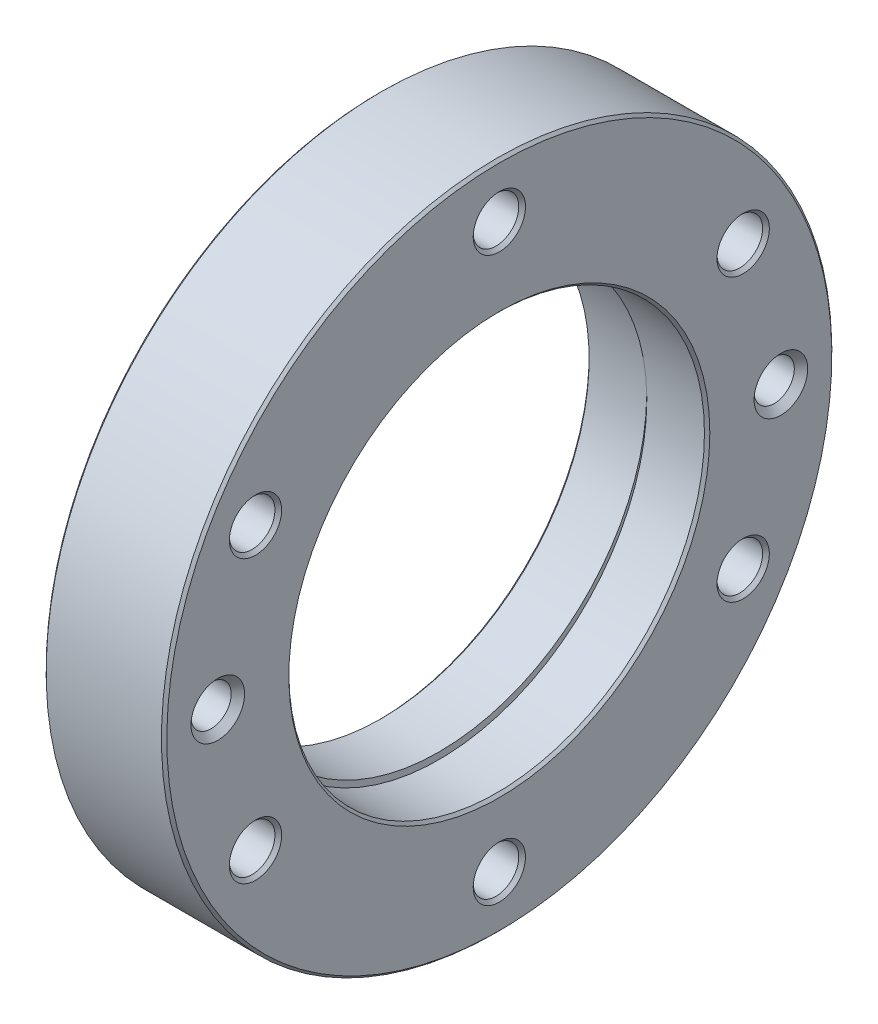
ISO-10303-21;
HEADER;
FILE_DESCRIPTION(('STEP AP214'),'2;1');
FILE_NAME('part.step','',(''),(''),'','','');
FILE_SCHEMA(('AUTOMOTIVE_DESIGN { 1 0 10303 214 1 1 1 1 }'));
ENDSEC;
DATA;
#1=APPLICATION_CONTEXT('core data for automotive mechanical design processes');
#2=APPLICATION_PROTOCOL_DEFINITION('international standard','automotive_design',2000,#1);
#3=PRODUCT_CONTEXT('',#1,'mechanical');
#4=PRODUCT('Part','Part','',(#3));
#5=PRODUCT_RELATED_PRODUCT_CATEGORY('part','',(#4));
#6=PRODUCT_DEFINITION_FORMATION('','',#4);
#7=PRODUCT_DEFINITION_CONTEXT('part definition',#1,'design');
#8=PRODUCT_DEFINITION('design','',#6,#7);
#9=PRODUCT_DEFINITION_SHAPE('','',#8);
#10=(LENGTH_UNIT() NAMED_UNIT(*) SI_UNIT(.MILLI.,.METRE.));
#11=(NAMED_UNIT(*) PLANE_ANGLE_UNIT() SI_UNIT($,.RADIAN.));
#12=(NAMED_UNIT(*) SI_UNIT($,.STERADIAN.) SOLID_ANGLE_UNIT());
#13=UNCERTAINTY_MEASURE_WITH_UNIT(LENGTH_MEASURE(1.E-05),#10,'distance_accuracy_value','');
#14=(GEOMETRIC_REPRESENTATION_CONTEXT(3) GLOBAL_UNCERTAINTY_ASSIGNED_CONTEXT((#13)) GLOBAL_UNIT_ASSIGNED_CONTEXT((#10,
#11,#12)) REPRESENTATION_CONTEXT('',''));
#15=CARTESIAN_POINT('',(0.,0.,0.));
#16=DIRECTION('',(0.,0.,1.));
#17=DIRECTION('',(1.,0.,0.));
#18=AXIS2_PLACEMENT_3D('',#15,#16,#17);
#19=CARTESIAN_POINT('',(57.8004303095138,-25.,0.));
#20=DIRECTION('',(-1.,0.,0.));
#21=DIRECTION('',(0.,-1.,0.));
#22=AXIS2_PLACEMENT_3D('',#19,#20,#21);
#23=PLANE('',#22);
#24=CARTESIAN_POINT('',(57.8004303095138,1.22515179113199E-11,0.));
#25=DIRECTION('',(-1.,0.,0.));
#26=DIRECTION('',(0.,-1.,0.));
#27=AXIS2_PLACEMENT_3D('',#24,#25,#26);
#28=CIRCLE('',#27,15.7000000000123);
#29=CARTESIAN_POINT('',(57.8004303095138,-15.7000000000001,0.));
#30=VERTEX_POINT('',#29);
#31=EDGE_CURVE('E95',#30,#30,#28,.F.);
#32=ORIENTED_EDGE('',*,*,#31,.T.);
#33=EDGE_LOOP('',(#32));
#34=FACE_BOUND('',#33,.T.);
#35=CARTESIAN_POINT('',(57.8004303095138,1.22515179113199E-11,0.));
#36=DIRECTION('',(-1.,0.,0.));
#37=DIRECTION('',(0.,-1.,0.));
#38=AXIS2_PLACEMENT_3D('',#35,#36,#37);
#39=CIRCLE('',#38,24.8000000000122);
#40=CARTESIAN_POINT('',(57.8004303095138,-24.8,0.));
#41=VERTEX_POINT('',#40);
#42=EDGE_CURVE('E88',#41,#41,#39,.T.);
#43=ORIENTED_EDGE('',*,*,#42,.T.);
#44=EDGE_LOOP('',(#43));
#45=FACE_BOUND('',#44,.T.);
#46=CARTESIAN_POINT('',(57.8004303095138,-10.5000000000002,18.1865334794731));
#47=DIRECTION('',(-1.,0.,0.));
#48=DIRECTION('',(0.,0.,1.));
#49=AXIS2_PLACEMENT_3D('',#46,#47,#48);
#50=CIRCLE('',#49,1.95);
#51=CARTESIAN_POINT('',(57.8004303095138,-10.5000000000002,20.1365334794731));
#52=VERTEX_POINT('',#51);
#53=EDGE_CURVE('E554',#52,#52,#50,.T.);
#54=ORIENTED_EDGE('',*,*,#53,.F.);
#55=EDGE_LOOP('',(#54));
#56=FACE_BOUND('',#55,.T.);
#57=CARTESIAN_POINT('',(57.8004303095138,10.4999999999998,18.1865334794733));
#58=DIRECTION('',(-1.,0.,0.));
#59=DIRECTION('',(0.,0.,1.));
#60=AXIS2_PLACEMENT_3D('',#57,#58,#59);
#61=CIRCLE('',#60,1.95);
#62=CARTESIAN_POINT('',(57.8004303095138,10.4999999999998,20.1365334794733));
#63=VERTEX_POINT('',#62);
#64=EDGE_CURVE('E558',#63,#63,#61,.T.);
#65=ORIENTED_EDGE('',*,*,#64,.F.);
#66=EDGE_LOOP('',(#65));
#67=FACE_BOUND('',#66,.T.);
#68=CARTESIAN_POINT('',(57.8004303095138,21.,0.));
#69=DIRECTION('',(-1.,0.,0.));
#70=DIRECTION('',(0.,0.,1.));
#71=AXIS2_PLACEMENT_3D('',#68,#69,#70);
#72=CIRCLE('',#71,1.95);
#73=CARTESIAN_POINT('',(57.8004303095138,21.,1.95));
#74=VERTEX_POINT('',#73);
#75=EDGE_CURVE('E562',#74,#74,#72,.T.);
#76=ORIENTED_EDGE('',*,*,#75,.F.);
#77=EDGE_LOOP('',(#76));
#78=FACE_BOUND('',#77,.T.);
#79=CARTESIAN_POINT('',(57.8004303095138,10.5000000000001,-18.1865334794732));
#80=DIRECTION('',(-1.,0.,0.));
#81=DIRECTION('',(0.,0.,1.));
#82=AXIS2_PLACEMENT_3D('',#79,#80,#81);
#83=CIRCLE('',#82,1.95);
#84=CARTESIAN_POINT('',(57.8004303095138,10.5000000000001,-16.2365334794732));
#85=VERTEX_POINT('',#84);
#86=EDGE_CURVE('E566',#85,#85,#83,.T.);
#87=ORIENTED_EDGE('',*,*,#86,.F.);
#88=EDGE_LOOP('',(#87));
#89=FACE_BOUND('',#88,.T.);
#90=CARTESIAN_POINT('',(57.8004303095138,-10.5,-18.1865334794732));
#91=DIRECTION('',(-1.,0.,0.));
#92=DIRECTION('',(0.,0.,1.));
#93=AXIS2_PLACEMENT_3D('',#90,#91,#92);
#94=CIRCLE('',#93,1.95);
#95=CARTESIAN_POINT('',(57.8004303095138,-10.5,-16.2365334794732));
#96=VERTEX_POINT('',#95);
#97=EDGE_CURVE('E570',#96,#96,#94,.T.);
#98=ORIENTED_EDGE('',*,*,#97,.F.);
#99=EDGE_LOOP('',(#98));
#100=FACE_BOUND('',#99,.T.);
#101=CARTESIAN_POINT('',(57.8004303095138,-21.,0.));
#102=DIRECTION('',(-1.,0.,0.));
#103=DIRECTION('',(0.,0.,1.));
#104=AXIS2_PLACEMENT_3D('',#101,#102,#103);
#105=CIRCLE('',#104,1.95);
#106=CARTESIAN_POINT('',(57.8004303095138,-21.,1.95));
#107=VERTEX_POINT('',#106);
#108=EDGE_CURVE('E574',#107,#107,#105,.T.);
#109=ORIENTED_EDGE('',*,*,#108,.F.);
#110=EDGE_LOOP('',(#109));
#111=FACE_BOUND('',#110,.T.);
#112=CARTESIAN_POINT('',(57.8004303095138,1.22494972441013E-11,-21.0000000000122));
#113=DIRECTION('',(-1.,0.,0.));
#114=DIRECTION('',(0.,0.,1.));
#115=AXIS2_PLACEMENT_3D('',#112,#113,#114);
#116=CIRCLE('',#115,2.);
#117=CARTESIAN_POINT('',(57.8004303095138,1.22494972441013E-11,-19.0000000000122));
#118=VERTEX_POINT('',#117);
#119=EDGE_CURVE('E578',#118,#118,#116,.T.);
#120=ORIENTED_EDGE('',*,*,#119,.F.);
#121=EDGE_LOOP('',(#120));
#122=FACE_BOUND('',#121,.T.);
#123=CARTESIAN_POINT('',(57.8004303095138,1.22520690023796E-11,21.0000000000122));
#124=DIRECTION('',(-1.,0.,0.));
#125=DIRECTION('',(0.,0.,1.));
#126=AXIS2_PLACEMENT_3D('',#123,#124,#125);
#127=CIRCLE('',#126,2.);
#128=CARTESIAN_POINT('',(57.8004303095138,1.22520690023796E-11,23.0000000000122));
#129=VERTEX_POINT('',#128);
#130=EDGE_CURVE('E581',#129,#129,#127,.T.);
#131=ORIENTED_EDGE('',*,*,#130,.F.);
#132=EDGE_LOOP('',(#131));
#133=FACE_BOUND('',#132,.T.);
#134=ADVANCED_FACE('F45',(#34,#45,#56,#67,#78,#89,#100,#111,#122,#133),#23,.T.);
#135=CARTESIAN_POINT('',(62.3004303095138,1.22517934568497E-11,0.));
#136=DIRECTION('',(-1.,0.,0.));
#137=DIRECTION('',(0.,-1.,0.));
#138=AXIS2_PLACEMENT_3D('',#135,#136,#137);
#139=CYLINDRICAL_SURFACE('',#138,15.5000000000123);
#140=CARTESIAN_POINT('',(58.0004303095138,1.22515301577879E-11,0.));
#141=DIRECTION('',(-1.,0.,0.));
#142=DIRECTION('',(0.,-1.,0.));
#143=AXIS2_PLACEMENT_3D('',#140,#141,#142);
#144=CIRCLE('',#143,15.5000000000123);
#145=CARTESIAN_POINT('',(58.0004303095138,-15.5000000000001,0.));
#146=VERTEX_POINT('',#145);
#147=EDGE_CURVE('E84',#146,#146,#144,.T.);
#148=ORIENTED_EDGE('',*,*,#147,.T.);
#149=EDGE_LOOP('',(#148));
#150=FACE_BOUND('',#149,.T.);
#151=CARTESIAN_POINT('',(62.3004303095138,1.22517934568497E-11,0.));
#152=DIRECTION('',(-1.,0.,0.));
#153=DIRECTION('',(0.,-1.,0.));
#154=AXIS2_PLACEMENT_3D('',#151,#152,#153);
#155=CIRCLE('',#154,15.5000000000123);
#156=CARTESIAN_POINT('',(62.3004303095138,-0.250000001532016,15.4979837398163));
#157=VERTEX_POINT('',#156);
#158=CARTESIAN_POINT('',(62.3004303095138,-0.250000001532016,-15.4979837398163));
#159=VERTEX_POINT('',#158);
#160=EDGE_CURVE('E79',#157,#159,#155,.T.);
#161=ORIENTED_EDGE('',*,*,#160,.F.);
#162=EDGE_CURVE('E66',#159,#157,#155,.T.);
#163=ORIENTED_EDGE('',*,*,#162,.F.);
#164=EDGE_LOOP('',(#161,#163));
#165=FACE_BOUND('',#164,.T.);
#166=ADVANCED_FACE('F78',(#150,#165),#139,.F.);
#167=CARTESIAN_POINT('',(62.3004303095138,-15.5000000000001,0.));
#168=DIRECTION('',(-1.,0.,0.));
#169=DIRECTION('',(0.,-1.,0.));
#170=AXIS2_PLACEMENT_3D('',#167,#168,#169);
#171=PLANE('',#170);
#172=CARTESIAN_POINT('',(62.3004303095138,-0.500000000036733,0.));
#173=DIRECTION('',(-1.,0.,0.));
#174=DIRECTION('',(0.,-1.,0.));
#175=AXIS2_PLACEMENT_3D('',#172,#173,#174);
#176=CIRCLE('',#175,15.4999999999633);
#177=EDGE_CURVE('E69',#157,#159,#176,.T.);
#178=ORIENTED_EDGE('',*,*,#177,.F.);
#179=ORIENTED_EDGE('',*,*,#160,.T.);
#180=EDGE_LOOP('',(#178,#179));
#181=FACE_BOUND('',#180,.T.);
#182=ADVANCED_FACE('F82',(#181),#171,.T.);
#183=CARTESIAN_POINT('',(66.8004303095138,1.22520690023796E-11,0.));
#184=DIRECTION('',(1.,0.,0.));
#185=DIRECTION('',(0.,1.,0.));
#186=AXIS2_PLACEMENT_3D('',#183,#184,#185);
#187=PLANE('',#186);
#188=CARTESIAN_POINT('',(66.8004303095138,-0.500000000036733,0.));
#189=DIRECTION('',(1.,0.,0.));
#190=DIRECTION('',(0.,1.,0.));
#191=AXIS2_PLACEMENT_3D('',#188,#189,#190);
#192=CIRCLE('',#191,15.6999999999633);
#193=CARTESIAN_POINT('',(66.8004303095138,15.1999999999266,0.));
#194=VERTEX_POINT('',#193);
#195=EDGE_CURVE('E55',#194,#194,#192,.F.);
#196=ORIENTED_EDGE('',*,*,#195,.T.);
#197=EDGE_LOOP('',(#196));
#198=FACE_BOUND('',#197,.T.);
#199=CARTESIAN_POINT('',(66.8004303095138,1.22520690023796E-11,0.));
#200=DIRECTION('',(1.,0.,0.));
#201=DIRECTION('',(0.,1.,0.));
#202=AXIS2_PLACEMENT_3D('',#199,#200,#201);
#203=CIRCLE('',#202,24.8000000000122);
#204=CARTESIAN_POINT('',(66.8004303095138,24.8000000000245,0.));
#205=VERTEX_POINT('',#204);
#206=EDGE_CURVE('E107',#205,#205,#203,.T.);
#207=ORIENTED_EDGE('',*,*,#206,.T.);
#208=EDGE_LOOP('',(#207));
#209=FACE_BOUND('',#208,.T.);
#210=CARTESIAN_POINT('',(66.8004303095138,-10.5000000000002,18.1865334794731));
#211=DIRECTION('',(-1.,0.,0.));
#212=DIRECTION('',(0.,0.,1.));
#213=AXIS2_PLACEMENT_3D('',#210,#211,#212);
#214=CIRCLE('',#213,1.95);
#215=CARTESIAN_POINT('',(66.8004303095138,-10.5000000000002,20.1365334794731));
#216=VERTEX_POINT('',#215);
#217=EDGE_CURVE('E700',#216,#216,#214,.T.);
#218=ORIENTED_EDGE('',*,*,#217,.T.);
#219=EDGE_LOOP('',(#218));
#220=FACE_BOUND('',#219,.T.);
#221=CARTESIAN_POINT('',(66.8004303095138,10.4999999999998,18.1865334794733));
#222=DIRECTION('',(-1.,0.,0.));
#223=DIRECTION('',(0.,0.,1.));
#224=AXIS2_PLACEMENT_3D('',#221,#222,#223);
#225=CIRCLE('',#224,1.95);
#226=CARTESIAN_POINT('',(66.8004303095138,10.4999999999998,20.1365334794733));
#227=VERTEX_POINT('',#226);
#228=EDGE_CURVE('E686',#227,#227,#225,.T.);
#229=ORIENTED_EDGE('',*,*,#228,.T.);
#230=EDGE_LOOP('',(#229));
#231=FACE_BOUND('',#230,.T.);
#232=CARTESIAN_POINT('',(66.8004303095138,21.,0.));
#233=DIRECTION('',(-1.,0.,0.));
#234=DIRECTION('',(0.,0.,1.));
#235=AXIS2_PLACEMENT_3D('',#232,#233,#234);
#236=CIRCLE('',#235,1.95);
#237=CARTESIAN_POINT('',(66.8004303095138,21.,1.95));
#238=VERTEX_POINT('',#237);
#239=EDGE_CURVE('E672',#238,#238,#236,.T.);
#240=ORIENTED_EDGE('',*,*,#239,.T.);
#241=EDGE_LOOP('',(#240));
#242=FACE_BOUND('',#241,.T.);
#243=CARTESIAN_POINT('',(66.8004303095138,10.5000000000001,-18.1865334794732));
#244=DIRECTION('',(-1.,0.,0.));
#245=DIRECTION('',(0.,0.,1.));
#246=AXIS2_PLACEMENT_3D('',#243,#244,#245);
#247=CIRCLE('',#246,1.95);
#248=CARTESIAN_POINT('',(66.8004303095138,10.5000000000001,-16.2365334794732));
#249=VERTEX_POINT('',#248);
#250=EDGE_CURVE('E658',#249,#249,#247,.T.);
#251=ORIENTED_EDGE('',*,*,#250,.T.);
#252=EDGE_LOOP('',(#251));
#253=FACE_BOUND('',#252,.T.);
#254=CARTESIAN_POINT('',(66.8004303095138,-10.5,-18.1865334794732));
#255=DIRECTION('',(-1.,0.,0.));
#256=DIRECTION('',(0.,0.,1.));
#257=AXIS2_PLACEMENT_3D('',#254,#255,#256);
#258=CIRCLE('',#257,1.95);
#259=CARTESIAN_POINT('',(66.8004303095138,-10.5,-16.2365334794732));
#260=VERTEX_POINT('',#259);
#261=EDGE_CURVE('E644',#260,#260,#258,.T.);
#262=ORIENTED_EDGE('',*,*,#261,.T.);
#263=EDGE_LOOP('',(#262));
#264=FACE_BOUND('',#263,.T.);
#265=CARTESIAN_POINT('',(66.8004303095138,-21.,0.));
#266=DIRECTION('',(-1.,0.,0.));
#267=DIRECTION('',(0.,0.,1.));
#268=AXIS2_PLACEMENT_3D('',#265,#266,#267);
#269=CIRCLE('',#268,1.95);
#270=CARTESIAN_POINT('',(66.8004303095138,-21.,1.95));
#271=VERTEX_POINT('',#270);
#272=EDGE_CURVE('E630',#271,#271,#269,.T.);
#273=ORIENTED_EDGE('',*,*,#272,.T.);
#274=EDGE_LOOP('',(#273));
#275=FACE_BOUND('',#274,.T.);
#276=CARTESIAN_POINT('',(66.8004303095138,1.22494972441013E-11,-21.0000000000122));
#277=DIRECTION('',(-1.,0.,0.));
#278=DIRECTION('',(0.,0.,1.));
#279=AXIS2_PLACEMENT_3D('',#276,#277,#278);
#280=CIRCLE('',#279,2.);
#281=CARTESIAN_POINT('',(66.8004303095138,1.22494972441013E-11,-19.0000000000122));
#282=VERTEX_POINT('',#281);
#283=EDGE_CURVE('E616',#282,#282,#280,.T.);
#284=ORIENTED_EDGE('',*,*,#283,.T.);
#285=EDGE_LOOP('',(#284));
#286=FACE_BOUND('',#285,.T.);
#287=CARTESIAN_POINT('',(66.8004303095138,1.22520690023796E-11,21.0000000000122));
#288=DIRECTION('',(-1.,0.,0.));
#289=DIRECTION('',(0.,0.,1.));
#290=AXIS2_PLACEMENT_3D('',#287,#288,#289);
#291=CIRCLE('',#290,2.);
#292=CARTESIAN_POINT('',(66.8004303095138,1.22520690023796E-11,23.0000000000122));
#293=VERTEX_POINT('',#292);
#294=EDGE_CURVE('E585',#293,#293,#291,.T.);
#295=ORIENTED_EDGE('',*,*,#294,.T.);
#296=EDGE_LOOP('',(#295));
#297=FACE_BOUND('',#296,.T.);
#298=ADVANCED_FACE('F115',(#198,#209,#220,#231,#242,#253,#264,#275,#286,#297),#187,.T.);
#299=CARTESIAN_POINT('',(62.3004303095138,1.22517934568497E-11,0.));
#300=DIRECTION('',(-1.,0.,0.));
#301=DIRECTION('',(0.,-1.,0.));
#302=AXIS2_PLACEMENT_3D('',#299,#300,#301);
#303=CYLINDRICAL_SURFACE('',#302,25.0000000000122);
#304=CARTESIAN_POINT('',(58.0004303095138,1.22515301577879E-11,0.));
#305=DIRECTION('',(-1.,0.,0.));
#306=DIRECTION('',(0.,-1.,0.));
#307=AXIS2_PLACEMENT_3D('',#304,#305,#306);
#308=CIRCLE('',#307,25.0000000000122);
#309=CARTESIAN_POINT('',(58.0004303095138,-25.,0.));
#310=VERTEX_POINT('',#309);
#311=EDGE_CURVE('E103',#310,#310,#308,.F.);
#312=ORIENTED_EDGE('',*,*,#311,.T.);
#313=EDGE_LOOP('',(#312));
#314=FACE_BOUND('',#313,.T.);
#315=CARTESIAN_POINT('',(66.6004303095138,1.22520567559116E-11,0.));
#316=DIRECTION('',(1.,0.,0.));
#317=DIRECTION('',(0.,1.,0.));
#318=AXIS2_PLACEMENT_3D('',#315,#316,#317);
#319=CIRCLE('',#318,25.0000000000122);
#320=CARTESIAN_POINT('',(66.6004303095138,25.0000000000245,0.));
#321=VERTEX_POINT('',#320);
#322=EDGE_CURVE('E99',#321,#321,#319,.F.);
#323=ORIENTED_EDGE('',*,*,#322,.T.);
#324=EDGE_LOOP('',(#323));
#325=FACE_BOUND('',#324,.T.);
#326=ADVANCED_FACE('F265',(#314,#325),#303,.T.);
#327=CARTESIAN_POINT('',(62.3004303095138,-0.500000000036733,0.));
#328=DIRECTION('',(-1.,0.,0.));
#329=DIRECTION('',(0.,-1.,0.));
#330=AXIS2_PLACEMENT_3D('',#327,#328,#329);
#331=CYLINDRICAL_SURFACE('',#330,15.4999999999633);
#332=CARTESIAN_POINT('',(66.6004303095138,-0.500000000036733,0.));
#333=DIRECTION('',(1.,0.,0.));
#334=DIRECTION('',(0.,0.,-1.));
#335=AXIS2_PLACEMENT_3D('',#332,#333,#334);
#336=CIRCLE('',#335,15.4999999999633);
#337=CARTESIAN_POINT('',(66.6004303095138,-0.500000000036733,-15.4999999999633));
#338=VERTEX_POINT('',#337);
#339=EDGE_CURVE('E11',#338,#338,#336,.T.);
#340=ORIENTED_EDGE('',*,*,#339,.T.);
#341=EDGE_LOOP('',(#340));
#342=FACE_BOUND('',#341,.T.);
#343=ORIENTED_EDGE('',*,*,#177,.T.);
#344=EDGE_CURVE('E61',#159,#157,#176,.T.);
#345=ORIENTED_EDGE('',*,*,#344,.T.);
#346=EDGE_LOOP('',(#343,#345));
#347=FACE_BOUND('',#346,.T.);
#348=ADVANCED_FACE('F72',(#342,#347),#331,.F.);
#349=CARTESIAN_POINT('',(62.3004303095138,-16.,0.));
#350=DIRECTION('',(-1.,0.,0.));
#351=DIRECTION('',(0.,-1.,0.));
#352=AXIS2_PLACEMENT_3D('',#349,#350,#351);
#353=PLANE('',#352);
#354=ORIENTED_EDGE('',*,*,#162,.T.);
#355=ORIENTED_EDGE('',*,*,#344,.F.);
#356=EDGE_LOOP('',(#354,#355));
#357=FACE_BOUND('',#356,.T.);
#358=ADVANCED_FACE('F64',(#357),#353,.F.);
#359=CARTESIAN_POINT('',(66.3004303095138,1.22520690023796E-11,21.0000000000122));
#360=DIRECTION('',(1.,0.,0.));
#361=DIRECTION('',(0.,0.,-1.));
#362=AXIS2_PLACEMENT_3D('',#359,#360,#361);
#363=CONICAL_SURFACE('',#362,1.5,0.785398163397434);
#364=ORIENTED_EDGE('',*,*,#294,.F.);
#365=EDGE_LOOP('',(#364));
#366=FACE_BOUND('',#365,.T.);
#367=CARTESIAN_POINT('',(66.3004303095138,1.22520690023796E-11,21.0000000000122));
#368=DIRECTION('',(-1.,0.,0.));
#369=DIRECTION('',(0.,0.,1.));
#370=AXIS2_PLACEMENT_3D('',#367,#368,#369);
#371=CIRCLE('',#370,1.5);
#372=CARTESIAN_POINT('',(66.3004303095138,1.22520690023796E-11,22.5000000000122));
#373=VERTEX_POINT('',#372);
#374=EDGE_CURVE('E70',#373,#373,#371,.T.);
#375=ORIENTED_EDGE('',*,*,#374,.T.);
#376=EDGE_LOOP('',(#375));
#377=FACE_BOUND('',#376,.T.);
#378=ADVANCED_FACE('F256',(#366,#377),#363,.F.);
#379=CARTESIAN_POINT('',(57.8004303095138,1.22520690023796E-11,21.0000000000122));
#380=DIRECTION('',(-1.,0.,0.));
#381=DIRECTION('',(0.,0.,1.));
#382=AXIS2_PLACEMENT_3D('',#379,#380,#381);
#383=CYLINDRICAL_SURFACE('',#382,1.5);
#384=ORIENTED_EDGE('',*,*,#374,.F.);
#385=EDGE_LOOP('',(#384));
#386=FACE_BOUND('',#385,.T.);
#387=CARTESIAN_POINT('',(58.3004303095138,1.22520690023796E-11,21.0000000000122));
#388=DIRECTION('',(-1.,0.,0.));
#389=DIRECTION('',(0.,0.,1.));
#390=AXIS2_PLACEMENT_3D('',#387,#388,#389);
#391=CIRCLE('',#390,1.5);
#392=CARTESIAN_POINT('',(58.3004303095138,1.22520690023796E-11,22.5000000000122));
#393=VERTEX_POINT('',#392);
#394=EDGE_CURVE('E584',#393,#393,#391,.T.);
#395=ORIENTED_EDGE('',*,*,#394,.T.);
#396=EDGE_LOOP('',(#395));
#397=FACE_BOUND('',#396,.T.);
#398=ADVANCED_FACE('F252',(#386,#397),#383,.F.);
#399=CARTESIAN_POINT('',(57.8004303095138,1.22520690023796E-11,21.0000000000122));
#400=DIRECTION('',(-1.,0.,0.));
#401=DIRECTION('',(0.,0.,1.));
#402=AXIS2_PLACEMENT_3D('',#399,#400,#401);
#403=CONICAL_SURFACE('',#402,2.,0.785398163397449);
#404=ORIENTED_EDGE('',*,*,#394,.F.);
#405=EDGE_LOOP('',(#404));
#406=FACE_BOUND('',#405,.T.);
#407=ORIENTED_EDGE('',*,*,#130,.T.);
#408=EDGE_LOOP('',(#407));
#409=FACE_BOUND('',#408,.T.);
#410=ADVANCED_FACE('F248',(#406,#409),#403,.F.);
#411=CARTESIAN_POINT('',(66.3004303095138,1.22494972441013E-11,-21.0000000000122));
#412=DIRECTION('',(1.,0.,0.));
#413=DIRECTION('',(0.,0.,-1.));
#414=AXIS2_PLACEMENT_3D('',#411,#412,#413);
#415=CONICAL_SURFACE('',#414,1.5,0.785398163397434);
#416=ORIENTED_EDGE('',*,*,#283,.F.);
#417=EDGE_LOOP('',(#416));
#418=FACE_BOUND('',#417,.T.);
#419=CARTESIAN_POINT('',(66.3004303095138,1.22494972441013E-11,-21.0000000000122));
#420=DIRECTION('',(-1.,0.,0.));
#421=DIRECTION('',(0.,0.,1.));
#422=AXIS2_PLACEMENT_3D('',#419,#420,#421);
#423=CIRCLE('',#422,1.5);
#424=CARTESIAN_POINT('',(66.3004303095138,1.22494972441013E-11,-19.5000000000122));
#425=VERTEX_POINT('',#424);
#426=EDGE_CURVE('E593',#425,#425,#423,.T.);
#427=ORIENTED_EDGE('',*,*,#426,.T.);
#428=EDGE_LOOP('',(#427));
#429=FACE_BOUND('',#428,.T.);
#430=ADVANCED_FACE('F244',(#418,#429),#415,.F.);
#431=CARTESIAN_POINT('',(57.8004303095138,1.22494972441013E-11,-21.0000000000122));
#432=DIRECTION('',(-1.,0.,0.));
#433=DIRECTION('',(0.,0.,1.));
#434=AXIS2_PLACEMENT_3D('',#431,#432,#433);
#435=CYLINDRICAL_SURFACE('',#434,1.5);
#436=ORIENTED_EDGE('',*,*,#426,.F.);
#437=EDGE_LOOP('',(#436));
#438=FACE_BOUND('',#437,.T.);
#439=CARTESIAN_POINT('',(58.3004303095138,1.22494972441013E-11,-21.0000000000122));
#440=DIRECTION('',(-1.,0.,0.));
#441=DIRECTION('',(0.,0.,1.));
#442=AXIS2_PLACEMENT_3D('',#439,#440,#441);
#443=CIRCLE('',#442,1.5);
#444=CARTESIAN_POINT('',(58.3004303095138,1.22494972441013E-11,-19.5000000000122));
#445=VERTEX_POINT('',#444);
#446=EDGE_CURVE('E610',#445,#445,#443,.T.);
#447=ORIENTED_EDGE('',*,*,#446,.T.);
#448=EDGE_LOOP('',(#447));
#449=FACE_BOUND('',#448,.T.);
#450=ADVANCED_FACE('F240',(#438,#449),#435,.F.);
#451=CARTESIAN_POINT('',(57.8004303095138,1.22494972441013E-11,-21.0000000000122));
#452=DIRECTION('',(-1.,0.,0.));
#453=DIRECTION('',(0.,0.,1.));
#454=AXIS2_PLACEMENT_3D('',#451,#452,#453);
#455=CONICAL_SURFACE('',#454,2.,0.785398163397449);
#456=ORIENTED_EDGE('',*,*,#446,.F.);
#457=EDGE_LOOP('',(#456));
#458=FACE_BOUND('',#457,.T.);
#459=ORIENTED_EDGE('',*,*,#119,.T.);
#460=EDGE_LOOP('',(#459));
#461=FACE_BOUND('',#460,.T.);
#462=ADVANCED_FACE('F236',(#458,#461),#455,.F.);
#463=CARTESIAN_POINT('',(66.5504303095138,-21.,0.));
#464=DIRECTION('',(1.,0.,0.));
#465=DIRECTION('',(0.,0.,-1.));
#466=AXIS2_PLACEMENT_3D('',#463,#464,#465);
#467=CONICAL_SURFACE('',#466,1.7,0.785398163397448);
#468=ORIENTED_EDGE('',*,*,#272,.F.);
#469=EDGE_LOOP('',(#468));
#470=FACE_BOUND('',#469,.T.);
#471=CARTESIAN_POINT('',(66.5504303095138,-21.,0.));
#472=DIRECTION('',(-1.,0.,0.));
#473=DIRECTION('',(0.,0.,1.));
#474=AXIS2_PLACEMENT_3D('',#471,#472,#473);
#475=CIRCLE('',#474,1.7);
#476=CARTESIAN_POINT('',(66.5504303095138,-21.,1.7));
#477=VERTEX_POINT('',#476);
#478=EDGE_CURVE('E620',#477,#477,#475,.T.);
#479=ORIENTED_EDGE('',*,*,#478,.T.);
#480=EDGE_LOOP('',(#479));
#481=FACE_BOUND('',#480,.T.);
#482=ADVANCED_FACE('F232',(#470,#481),#467,.F.);
#483=CARTESIAN_POINT('',(57.8004303095138,-21.,0.));
#484=DIRECTION('',(-1.,0.,0.));
#485=DIRECTION('',(0.,0.,1.));
#486=AXIS2_PLACEMENT_3D('',#483,#484,#485);
#487=CYLINDRICAL_SURFACE('',#486,1.7);
#488=ORIENTED_EDGE('',*,*,#478,.F.);
#489=EDGE_LOOP('',(#488));
#490=FACE_BOUND('',#489,.T.);
#491=CARTESIAN_POINT('',(58.0504303095138,-21.,0.));
#492=DIRECTION('',(-1.,0.,0.));
#493=DIRECTION('',(0.,0.,1.));
#494=AXIS2_PLACEMENT_3D('',#491,#492,#493);
#495=CIRCLE('',#494,1.7);
#496=CARTESIAN_POINT('',(58.0504303095138,-21.,1.7));
#497=VERTEX_POINT('',#496);
#498=EDGE_CURVE('E624',#497,#497,#495,.T.);
#499=ORIENTED_EDGE('',*,*,#498,.T.);
#500=EDGE_LOOP('',(#499));
#501=FACE_BOUND('',#500,.T.);
#502=ADVANCED_FACE('F228',(#490,#501),#487,.F.);
#503=CARTESIAN_POINT('',(57.8004303095138,-21.,0.));
#504=DIRECTION('',(-1.,0.,0.));
#505=DIRECTION('',(0.,0.,1.));
#506=AXIS2_PLACEMENT_3D('',#503,#504,#505);
#507=CONICAL_SURFACE('',#506,1.95,0.785398163397448);
#508=ORIENTED_EDGE('',*,*,#498,.F.);
#509=EDGE_LOOP('',(#508));
#510=FACE_BOUND('',#509,.T.);
#511=ORIENTED_EDGE('',*,*,#108,.T.);
#512=EDGE_LOOP('',(#511));
#513=FACE_BOUND('',#512,.T.);
#514=ADVANCED_FACE('F224',(#510,#513),#507,.F.);
#515=CARTESIAN_POINT('',(66.5504303095138,-10.5,-18.1865334794732));
#516=DIRECTION('',(1.,0.,0.));
#517=DIRECTION('',(0.,0.,-1.));
#518=AXIS2_PLACEMENT_3D('',#515,#516,#517);
#519=CONICAL_SURFACE('',#518,1.7,0.785398163397448);
#520=ORIENTED_EDGE('',*,*,#261,.F.);
#521=EDGE_LOOP('',(#520));
#522=FACE_BOUND('',#521,.T.);
#523=CARTESIAN_POINT('',(66.5504303095138,-10.5,-18.1865334794732));
#524=DIRECTION('',(-1.,0.,0.));
#525=DIRECTION('',(0.,0.,1.));
#526=AXIS2_PLACEMENT_3D('',#523,#524,#525);
#527=CIRCLE('',#526,1.7);
#528=CARTESIAN_POINT('',(66.5504303095138,-10.5,-16.4865334794732));
#529=VERTEX_POINT('',#528);
#530=EDGE_CURVE('E634',#529,#529,#527,.T.);
#531=ORIENTED_EDGE('',*,*,#530,.T.);
#532=EDGE_LOOP('',(#531));
#533=FACE_BOUND('',#532,.T.);
#534=ADVANCED_FACE('F220',(#522,#533),#519,.F.);
#535=CARTESIAN_POINT('',(57.8004303095138,-10.5,-18.1865334794732));
#536=DIRECTION('',(-1.,0.,0.));
#537=DIRECTION('',(0.,0.,1.));
#538=AXIS2_PLACEMENT_3D('',#535,#536,#537);
#539=CYLINDRICAL_SURFACE('',#538,1.7);
#540=ORIENTED_EDGE('',*,*,#530,.F.);
#541=EDGE_LOOP('',(#540));
#542=FACE_BOUND('',#541,.T.);
#543=CARTESIAN_POINT('',(58.0504303095138,-10.5,-18.1865334794732));
#544=DIRECTION('',(-1.,0.,0.));
#545=DIRECTION('',(0.,0.,1.));
#546=AXIS2_PLACEMENT_3D('',#543,#544,#545);
#547=CIRCLE('',#546,1.7);
#548=CARTESIAN_POINT('',(58.0504303095138,-10.5,-16.4865334794732));
#549=VERTEX_POINT('',#548);
#550=EDGE_CURVE('E638',#549,#549,#547,.T.);
#551=ORIENTED_EDGE('',*,*,#550,.T.);
#552=EDGE_LOOP('',(#551));
#553=FACE_BOUND('',#552,.T.);
#554=ADVANCED_FACE('F216',(#542,#553),#539,.F.);
#555=CARTESIAN_POINT('',(57.8004303095138,-10.5,-18.1865334794732));
#556=DIRECTION('',(-1.,0.,0.));
#557=DIRECTION('',(0.,0.,1.));
#558=AXIS2_PLACEMENT_3D('',#555,#556,#557);
#559=CONICAL_SURFACE('',#558,1.95,0.785398163397452);
#560=ORIENTED_EDGE('',*,*,#550,.F.);
#561=EDGE_LOOP('',(#560));
#562=FACE_BOUND('',#561,.T.);
#563=ORIENTED_EDGE('',*,*,#97,.T.);
#564=EDGE_LOOP('',(#563));
#565=FACE_BOUND('',#564,.T.);
#566=ADVANCED_FACE('F212',(#562,#565),#559,.F.);
#567=CARTESIAN_POINT('',(66.5504303095138,10.5000000000001,-18.1865334794732));
#568=DIRECTION('',(1.,0.,0.));
#569=DIRECTION('',(0.,0.,-1.));
#570=AXIS2_PLACEMENT_3D('',#567,#568,#569);
#571=CONICAL_SURFACE('',#570,1.7,0.785398163397448);
#572=ORIENTED_EDGE('',*,*,#250,.F.);
#573=EDGE_LOOP('',(#572));
#574=FACE_BOUND('',#573,.T.);
#575=CARTESIAN_POINT('',(66.5504303095138,10.5000000000001,-18.1865334794732));
#576=DIRECTION('',(-1.,0.,0.));
#577=DIRECTION('',(0.,0.,1.));
#578=AXIS2_PLACEMENT_3D('',#575,#576,#577);
#579=CIRCLE('',#578,1.7);
#580=CARTESIAN_POINT('',(66.5504303095138,10.5000000000001,-16.4865334794732));
#581=VERTEX_POINT('',#580);
#582=EDGE_CURVE('E648',#581,#581,#579,.T.);
#583=ORIENTED_EDGE('',*,*,#582,.T.);
#584=EDGE_LOOP('',(#583));
#585=FACE_BOUND('',#584,.T.);
#586=ADVANCED_FACE('F208',(#574,#585),#571,.F.);
#587=CARTESIAN_POINT('',(57.8004303095138,10.5000000000001,-18.1865334794732));
#588=DIRECTION('',(-1.,0.,0.));
#589=DIRECTION('',(0.,0.,1.));
#590=AXIS2_PLACEMENT_3D('',#587,#588,#589);
#591=CYLINDRICAL_SURFACE('',#590,1.7);
#592=ORIENTED_EDGE('',*,*,#582,.F.);
#593=EDGE_LOOP('',(#592));
#594=FACE_BOUND('',#593,.T.);
#595=CARTESIAN_POINT('',(58.0504303095138,10.5000000000001,-18.1865334794732));
#596=DIRECTION('',(-1.,0.,0.));
#597=DIRECTION('',(0.,0.,1.));
#598=AXIS2_PLACEMENT_3D('',#595,#596,#597);
#599=CIRCLE('',#598,1.7);
#600=CARTESIAN_POINT('',(58.0504303095138,10.5000000000001,-16.4865334794732));
#601=VERTEX_POINT('',#600);
#602=EDGE_CURVE('E652',#601,#601,#599,.T.);
#603=ORIENTED_EDGE('',*,*,#602,.T.);
#604=EDGE_LOOP('',(#603));
#605=FACE_BOUND('',#604,.T.);
#606=ADVANCED_FACE('F204',(#594,#605),#591,.F.);
#607=CARTESIAN_POINT('',(57.8004303095138,10.5000000000001,-18.1865334794732));
#608=DIRECTION('',(-1.,0.,0.));
#609=DIRECTION('',(0.,0.,1.));
#610=AXIS2_PLACEMENT_3D('',#607,#608,#609);
#611=CONICAL_SURFACE('',#610,1.95,0.785398163397452);
#612=ORIENTED_EDGE('',*,*,#602,.F.);
#613=EDGE_LOOP('',(#612));
#614=FACE_BOUND('',#613,.T.);
#615=ORIENTED_EDGE('',*,*,#86,.T.);
#616=EDGE_LOOP('',(#615));
#617=FACE_BOUND('',#616,.T.);
#618=ADVANCED_FACE('F200',(#614,#617),#611,.F.);
#619=CARTESIAN_POINT('',(66.5504303095138,21.,0.));
#620=DIRECTION('',(1.,0.,0.));
#621=DIRECTION('',(0.,0.,-1.));
#622=AXIS2_PLACEMENT_3D('',#619,#620,#621);
#623=CONICAL_SURFACE('',#622,1.7,0.785398163397448);
#624=ORIENTED_EDGE('',*,*,#239,.F.);
#625=EDGE_LOOP('',(#624));
#626=FACE_BOUND('',#625,.T.);
#627=CARTESIAN_POINT('',(66.5504303095138,21.,0.));
#628=DIRECTION('',(-1.,0.,0.));
#629=DIRECTION('',(0.,0.,1.));
#630=AXIS2_PLACEMENT_3D('',#627,#628,#629);
#631=CIRCLE('',#630,1.7);
#632=CARTESIAN_POINT('',(66.5504303095138,21.,1.7));
#633=VERTEX_POINT('',#632);
#634=EDGE_CURVE('E662',#633,#633,#631,.T.);
#635=ORIENTED_EDGE('',*,*,#634,.T.);
#636=EDGE_LOOP('',(#635));
#637=FACE_BOUND('',#636,.T.);
#638=ADVANCED_FACE('F196',(#626,#637),#623,.F.);
#639=CARTESIAN_POINT('',(57.8004303095138,21.,0.));
#640=DIRECTION('',(-1.,0.,0.));
#641=DIRECTION('',(0.,0.,1.));
#642=AXIS2_PLACEMENT_3D('',#639,#640,#641);
#643=CYLINDRICAL_SURFACE('',#642,1.7);
#644=ORIENTED_EDGE('',*,*,#634,.F.);
#645=EDGE_LOOP('',(#644));
#646=FACE_BOUND('',#645,.T.);
#647=CARTESIAN_POINT('',(58.0504303095138,21.,0.));
#648=DIRECTION('',(-1.,0.,0.));
#649=DIRECTION('',(0.,0.,1.));
#650=AXIS2_PLACEMENT_3D('',#647,#648,#649);
#651=CIRCLE('',#650,1.7);
#652=CARTESIAN_POINT('',(58.0504303095138,21.,1.7));
#653=VERTEX_POINT('',#652);
#654=EDGE_CURVE('E666',#653,#653,#651,.T.);
#655=ORIENTED_EDGE('',*,*,#654,.T.);
#656=EDGE_LOOP('',(#655));
#657=FACE_BOUND('',#656,.T.);
#658=ADVANCED_FACE('F192',(#646,#657),#643,.F.);
#659=CARTESIAN_POINT('',(57.8004303095138,21.,0.));
#660=DIRECTION('',(-1.,0.,0.));
#661=DIRECTION('',(0.,0.,1.));
#662=AXIS2_PLACEMENT_3D('',#659,#660,#661);
#663=CONICAL_SURFACE('',#662,1.95,0.785398163397448);
#664=ORIENTED_EDGE('',*,*,#654,.F.);
#665=EDGE_LOOP('',(#664));
#666=FACE_BOUND('',#665,.T.);
#667=ORIENTED_EDGE('',*,*,#75,.T.);
#668=EDGE_LOOP('',(#667));
#669=FACE_BOUND('',#668,.T.);
#670=ADVANCED_FACE('F188',(#666,#669),#663,.F.);
#671=CARTESIAN_POINT('',(66.5504303095138,10.4999999999998,18.1865334794733));
#672=DIRECTION('',(1.,0.,0.));
#673=DIRECTION('',(0.,0.,-1.));
#674=AXIS2_PLACEMENT_3D('',#671,#672,#673);
#675=CONICAL_SURFACE('',#674,1.7,0.785398163397445);
#676=ORIENTED_EDGE('',*,*,#228,.F.);
#677=EDGE_LOOP('',(#676));
#678=FACE_BOUND('',#677,.T.);
#679=CARTESIAN_POINT('',(66.5504303095138,10.4999999999998,18.1865334794733));
#680=DIRECTION('',(-1.,0.,0.));
#681=DIRECTION('',(0.,0.,1.));
#682=AXIS2_PLACEMENT_3D('',#679,#680,#681);
#683=CIRCLE('',#682,1.7);
#684=CARTESIAN_POINT('',(66.5504303095138,10.4999999999998,19.8865334794733));
#685=VERTEX_POINT('',#684);
#686=EDGE_CURVE('E676',#685,#685,#683,.T.);
#687=ORIENTED_EDGE('',*,*,#686,.T.);
#688=EDGE_LOOP('',(#687));
#689=FACE_BOUND('',#688,.T.);
#690=ADVANCED_FACE('F184',(#678,#689),#675,.F.);
#691=CARTESIAN_POINT('',(57.8004303095138,10.4999999999998,18.1865334794733));
#692=DIRECTION('',(-1.,0.,0.));
#693=DIRECTION('',(0.,0.,1.));
#694=AXIS2_PLACEMENT_3D('',#691,#692,#693);
#695=CYLINDRICAL_SURFACE('',#694,1.7);
#696=ORIENTED_EDGE('',*,*,#686,.F.);
#697=EDGE_LOOP('',(#696));
#698=FACE_BOUND('',#697,.T.);
#699=CARTESIAN_POINT('',(58.0504303095138,10.4999999999998,18.1865334794733));
#700=DIRECTION('',(-1.,0.,0.));
#701=DIRECTION('',(0.,0.,1.));
#702=AXIS2_PLACEMENT_3D('',#699,#700,#701);
#703=CIRCLE('',#702,1.7);
#704=CARTESIAN_POINT('',(58.0504303095138,10.4999999999998,19.8865334794733));
#705=VERTEX_POINT('',#704);
#706=EDGE_CURVE('E680',#705,#705,#703,.T.);
#707=ORIENTED_EDGE('',*,*,#706,.T.);
#708=EDGE_LOOP('',(#707));
#709=FACE_BOUND('',#708,.T.);
#710=ADVANCED_FACE('F180',(#698,#709),#695,.F.);
#711=CARTESIAN_POINT('',(57.8004303095138,10.4999999999998,18.1865334794733));
#712=DIRECTION('',(-1.,0.,0.));
#713=DIRECTION('',(0.,0.,1.));
#714=AXIS2_PLACEMENT_3D('',#711,#712,#713);
#715=CONICAL_SURFACE('',#714,1.95,0.785398163397452);
#716=ORIENTED_EDGE('',*,*,#706,.F.);
#717=EDGE_LOOP('',(#716));
#718=FACE_BOUND('',#717,.T.);
#719=ORIENTED_EDGE('',*,*,#64,.T.);
#720=EDGE_LOOP('',(#719));
#721=FACE_BOUND('',#720,.T.);
#722=ADVANCED_FACE('F176',(#718,#721),#715,.F.);
#723=CARTESIAN_POINT('',(66.5504303095138,-10.5000000000002,18.1865334794731));
#724=DIRECTION('',(1.,0.,0.));
#725=DIRECTION('',(0.,0.,-1.));
#726=AXIS2_PLACEMENT_3D('',#723,#724,#725);
#727=CONICAL_SURFACE('',#726,1.7,0.785398163397448);
#728=ORIENTED_EDGE('',*,*,#217,.F.);
#729=EDGE_LOOP('',(#728));
#730=FACE_BOUND('',#729,.T.);
#731=CARTESIAN_POINT('',(66.5504303095138,-10.5000000000002,18.1865334794731));
#732=DIRECTION('',(-1.,0.,0.));
#733=DIRECTION('',(0.,0.,1.));
#734=AXIS2_PLACEMENT_3D('',#731,#732,#733);
#735=CIRCLE('',#734,1.7);
#736=CARTESIAN_POINT('',(66.5504303095138,-10.5000000000002,19.8865334794731));
#737=VERTEX_POINT('',#736);
#738=EDGE_CURVE('E690',#737,#737,#735,.T.);
#739=ORIENTED_EDGE('',*,*,#738,.T.);
#740=EDGE_LOOP('',(#739));
#741=FACE_BOUND('',#740,.T.);
#742=ADVANCED_FACE('F168',(#730,#741),#727,.F.);
#743=CARTESIAN_POINT('',(57.8004303095138,-10.5000000000002,18.1865334794731));
#744=DIRECTION('',(-1.,0.,0.));
#745=DIRECTION('',(0.,0.,1.));
#746=AXIS2_PLACEMENT_3D('',#743,#744,#745);
#747=CYLINDRICAL_SURFACE('',#746,1.7);
#748=ORIENTED_EDGE('',*,*,#738,.F.);
#749=EDGE_LOOP('',(#748));
#750=FACE_BOUND('',#749,.T.);
#751=CARTESIAN_POINT('',(58.0504303095138,-10.5000000000002,18.1865334794731));
#752=DIRECTION('',(-1.,0.,0.));
#753=DIRECTION('',(0.,0.,1.));
#754=AXIS2_PLACEMENT_3D('',#751,#752,#753);
#755=CIRCLE('',#754,1.7);
#756=CARTESIAN_POINT('',(58.0504303095138,-10.5000000000002,19.8865334794731));
#757=VERTEX_POINT('',#756);
#758=EDGE_CURVE('E694',#757,#757,#755,.T.);
#759=ORIENTED_EDGE('',*,*,#758,.T.);
#760=EDGE_LOOP('',(#759));
#761=FACE_BOUND('',#760,.T.);
#762=ADVANCED_FACE('F159',(#750,#761),#747,.F.);
#763=CARTESIAN_POINT('',(57.8004303095138,-10.5000000000002,18.1865334794731));
#764=DIRECTION('',(-1.,0.,0.));
#765=DIRECTION('',(0.,0.,1.));
#766=AXIS2_PLACEMENT_3D('',#763,#764,#765);
#767=CONICAL_SURFACE('',#766,1.95,0.785398163397452);
#768=ORIENTED_EDGE('',*,*,#758,.F.);
#769=EDGE_LOOP('',(#768));
#770=FACE_BOUND('',#769,.T.);
#771=ORIENTED_EDGE('',*,*,#53,.T.);
#772=EDGE_LOOP('',(#771));
#773=FACE_BOUND('',#772,.T.);
#774=ADVANCED_FACE('F148',(#770,#773),#767,.F.);
#775=CARTESIAN_POINT('',(58.0004303095138,1.22515301577879E-11,0.));
#776=DIRECTION('',(-1.,0.,0.));
#777=DIRECTION('',(0.,-1.,0.));
#778=AXIS2_PLACEMENT_3D('',#775,#776,#777);
#779=CONICAL_SURFACE('',#778,15.5000000000123,0.785398163397422);
#780=ORIENTED_EDGE('',*,*,#31,.F.);
#781=EDGE_LOOP('',(#780));
#782=FACE_BOUND('',#781,.T.);
#783=ORIENTED_EDGE('',*,*,#147,.F.);
#784=EDGE_LOOP('',(#783));
#785=FACE_BOUND('',#784,.T.);
#786=ADVANCED_FACE('F127',(#782,#785),#779,.F.);
#787=CARTESIAN_POINT('',(57.8004303095138,1.22515179113199E-11,0.));
#788=DIRECTION('',(1.,0.,0.));
#789=DIRECTION('',(0.,1.,0.));
#790=AXIS2_PLACEMENT_3D('',#787,#788,#789);
#791=CONICAL_SURFACE('',#790,24.8000000000122,0.785398163397448);
#792=ORIENTED_EDGE('',*,*,#311,.F.);
#793=EDGE_LOOP('',(#792));
#794=FACE_BOUND('',#793,.T.);
#795=ORIENTED_EDGE('',*,*,#42,.F.);
#796=EDGE_LOOP('',(#795));
#797=FACE_BOUND('',#796,.T.);
#798=ADVANCED_FACE('F120',(#794,#797),#791,.T.);
#799=CARTESIAN_POINT('',(66.8004303095138,-0.500000000036733,0.));
#800=DIRECTION('',(1.,0.,0.));
#801=DIRECTION('',(0.,0.,-1.));
#802=AXIS2_PLACEMENT_3D('',#799,#800,#801);
#803=CONICAL_SURFACE('',#802,15.6999999999633,0.785398163397444);
#804=ORIENTED_EDGE('',*,*,#339,.F.);
#805=EDGE_LOOP('',(#804));
#806=FACE_BOUND('',#805,.T.);
#807=ORIENTED_EDGE('',*,*,#195,.F.);
#808=EDGE_LOOP('',(#807));
#809=FACE_BOUND('',#808,.T.);
#810=ADVANCED_FACE('F118',(#806,#809),#803,.F.);
#811=CARTESIAN_POINT('',(66.6004303095138,1.22520567559116E-11,0.));
#812=DIRECTION('',(-1.,0.,0.));
#813=DIRECTION('',(0.,-1.,0.));
#814=AXIS2_PLACEMENT_3D('',#811,#812,#813);
#815=CONICAL_SURFACE('',#814,25.0000000000122,0.785398163397466);
#816=ORIENTED_EDGE('',*,*,#206,.F.);
#817=EDGE_LOOP('',(#816));
#818=FACE_BOUND('',#817,.T.);
#819=ORIENTED_EDGE('',*,*,#322,.F.);
#820=EDGE_LOOP('',(#819));
#821=FACE_BOUND('',#820,.T.);
#822=ADVANCED_FACE('F48',(#818,#821),#815,.T.);
#823=CLOSED_SHELL('',(#134,#166,#182,#298,#326,#348,#358,#378,#398,#410,#430,#450,#462,#482,
#502,#514,#534,#554,#566,#586,#606,#618,#638,#658,#670,#690,#710,#722,#742,#762,#774,#786,#798,
#810,#822));
#824=MANIFOLD_SOLID_BREP('B2',#823);
#825=ADVANCED_BREP_SHAPE_REPRESENTATION('',(#18,#824),#14);
#826=SHAPE_DEFINITION_REPRESENTATION(#9,#825);
ENDSEC;
END-ISO-10303-21;
